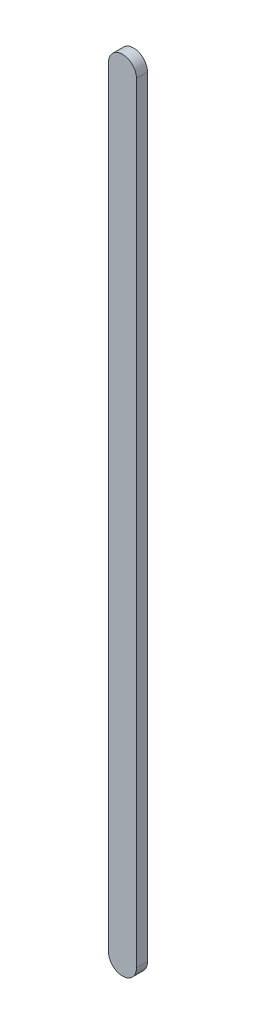
ISO-10303-21;
HEADER;
FILE_DESCRIPTION(('STEP AP214'),'2;1');
FILE_NAME('part.step','',(''),(''),'','','');
FILE_SCHEMA(('AUTOMOTIVE_DESIGN { 1 0 10303 214 1 1 1 1 }'));
ENDSEC;
DATA;
#1=APPLICATION_CONTEXT('core data for automotive mechanical design processes');
#2=APPLICATION_PROTOCOL_DEFINITION('international standard','automotive_design',2000,#1);
#3=PRODUCT_CONTEXT('',#1,'mechanical');
#4=PRODUCT('Part','Part','',(#3));
#5=PRODUCT_RELATED_PRODUCT_CATEGORY('part','',(#4));
#6=PRODUCT_DEFINITION_FORMATION('','',#4);
#7=PRODUCT_DEFINITION_CONTEXT('part definition',#1,'design');
#8=PRODUCT_DEFINITION('design','',#6,#7);
#9=PRODUCT_DEFINITION_SHAPE('','',#8);
#10=(LENGTH_UNIT() NAMED_UNIT(*) SI_UNIT(.MILLI.,.METRE.));
#11=(NAMED_UNIT(*) PLANE_ANGLE_UNIT() SI_UNIT($,.RADIAN.));
#12=(NAMED_UNIT(*) SI_UNIT($,.STERADIAN.) SOLID_ANGLE_UNIT());
#13=UNCERTAINTY_MEASURE_WITH_UNIT(LENGTH_MEASURE(1.E-05),#10,'distance_accuracy_value','');
#14=(GEOMETRIC_REPRESENTATION_CONTEXT(3) GLOBAL_UNCERTAINTY_ASSIGNED_CONTEXT((#13)) GLOBAL_UNIT_ASSIGNED_CONTEXT((#10,
#11,#12)) REPRESENTATION_CONTEXT('',''));
#15=CARTESIAN_POINT('',(0.,0.,0.));
#16=DIRECTION('',(0.,0.,1.));
#17=DIRECTION('',(1.,0.,0.));
#18=AXIS2_PLACEMENT_3D('',#15,#16,#17);
#19=CARTESIAN_POINT('',(96.266,67.183,0.));
#20=DIRECTION('',(-1.,0.,0.));
#21=DIRECTION('',(0.,1.,0.));
#22=AXIS2_PLACEMENT_3D('',#19,#20,#21);
#23=PLANE('',#22);
#24=DIRECTION('',(0.,1.,0.));
#25=VECTOR('',#24,1.);
#26=CARTESIAN_POINT('',(96.266,67.183,0.1999996));
#27=LINE('',#26,#25);
#28=CARTESIAN_POINT('',(96.266,67.183,0.1999996));
#29=VERTEX_POINT('',#28);
#30=CARTESIAN_POINT('',(96.266,81.1500028,0.1999996));
#31=VERTEX_POINT('',#30);
#32=EDGE_CURVE('E11',#29,#31,#27,.T.);
#33=ORIENTED_EDGE('',*,*,#32,.F.);
#34=DIRECTION('',(0.,0.,1.));
#35=VECTOR('',#34,1.);
#36=CARTESIAN_POINT('',(96.266,67.183,0.));
#37=LINE('',#36,#35);
#38=CARTESIAN_POINT('',(96.266,67.183,0.));
#39=VERTEX_POINT('',#38);
#40=EDGE_CURVE('E24',#39,#29,#37,.T.);
#41=ORIENTED_EDGE('',*,*,#40,.F.);
#42=DIRECTION('',(0.,1.,0.));
#43=VECTOR('',#42,1.);
#44=CARTESIAN_POINT('',(96.266,67.183,0.));
#45=LINE('',#44,#43);
#46=CARTESIAN_POINT('',(96.266,81.1500028,0.));
#47=VERTEX_POINT('',#46);
#48=EDGE_CURVE('E75',#39,#47,#45,.T.);
#49=ORIENTED_EDGE('',*,*,#48,.T.);
#50=DIRECTION('',(0.,0.,1.));
#51=VECTOR('',#50,1.);
#52=CARTESIAN_POINT('',(96.266,81.1500028,0.));
#53=LINE('',#52,#51);
#54=EDGE_CURVE('E37',#47,#31,#53,.T.);
#55=ORIENTED_EDGE('',*,*,#54,.T.);
#56=EDGE_LOOP('',(#33,#41,#49,#55));
#57=FACE_BOUND('',#56,.T.);
#58=ADVANCED_FACE('F17',(#57),#23,.F.);
#59=CARTESIAN_POINT('',(96.012,81.1500028,0.));
#60=DIRECTION('',(0.,0.,-1.));
#61=DIRECTION('',(1.,1.11896493820486E-13,0.));
#62=AXIS2_PLACEMENT_3D('',#59,#60,#61);
#63=CYLINDRICAL_SURFACE('',#62,0.25400000000001);
#64=CARTESIAN_POINT('',(96.012,81.1500028,0.1999996));
#65=DIRECTION('',(0.,0.,1.));
#66=DIRECTION('',(1.,1.11896493820486E-13,0.));
#67=AXIS2_PLACEMENT_3D('',#64,#65,#66);
#68=CIRCLE('',#67,0.25400000000001);
#69=CARTESIAN_POINT('',(95.758,81.1500028,0.1999996));
#70=VERTEX_POINT('',#69);
#71=EDGE_CURVE('E83',#31,#70,#68,.T.);
#72=ORIENTED_EDGE('',*,*,#71,.F.);
#73=ORIENTED_EDGE('',*,*,#54,.F.);
#74=CARTESIAN_POINT('',(96.012,81.1500028,0.));
#75=DIRECTION('',(0.,0.,1.));
#76=DIRECTION('',(1.,1.11896493820486E-13,0.));
#77=AXIS2_PLACEMENT_3D('',#74,#75,#76);
#78=CIRCLE('',#77,0.25400000000001);
#79=CARTESIAN_POINT('',(95.758,81.1500028,0.));
#80=VERTEX_POINT('',#79);
#81=EDGE_CURVE('E81',#47,#80,#78,.T.);
#82=ORIENTED_EDGE('',*,*,#81,.T.);
#83=DIRECTION('',(0.,0.,1.));
#84=VECTOR('',#83,1.);
#85=CARTESIAN_POINT('',(95.758,81.1500028,0.));
#86=LINE('',#85,#84);
#87=EDGE_CURVE('E67',#80,#70,#86,.T.);
#88=ORIENTED_EDGE('',*,*,#87,.T.);
#89=EDGE_LOOP('',(#72,#73,#82,#88));
#90=FACE_BOUND('',#89,.T.);
#91=ADVANCED_FACE('F89',(#90),#63,.T.);
#92=CARTESIAN_POINT('',(95.758,81.1500028,0.));
#93=DIRECTION('',(1.,0.,0.));
#94=DIRECTION('',(0.,-1.,0.));
#95=AXIS2_PLACEMENT_3D('',#92,#93,#94);
#96=PLANE('',#95);
#97=DIRECTION('',(0.,-1.,0.));
#98=VECTOR('',#97,1.);
#99=CARTESIAN_POINT('',(95.758,81.1500028,0.1999996));
#100=LINE('',#99,#98);
#101=CARTESIAN_POINT('',(95.758,67.183,0.1999996));
#102=VERTEX_POINT('',#101);
#103=EDGE_CURVE('E71',#70,#102,#100,.T.);
#104=ORIENTED_EDGE('',*,*,#103,.F.);
#105=ORIENTED_EDGE('',*,*,#87,.F.);
#106=DIRECTION('',(0.,-1.,0.));
#107=VECTOR('',#106,1.);
#108=CARTESIAN_POINT('',(95.758,81.1500028,0.));
#109=LINE('',#108,#107);
#110=CARTESIAN_POINT('',(95.758,67.183,0.));
#111=VERTEX_POINT('',#110);
#112=EDGE_CURVE('E63',#80,#111,#109,.T.);
#113=ORIENTED_EDGE('',*,*,#112,.T.);
#114=DIRECTION('',(0.,0.,1.));
#115=VECTOR('',#114,1.);
#116=CARTESIAN_POINT('',(95.758,67.183,0.));
#117=LINE('',#116,#115);
#118=EDGE_CURVE('E53',#111,#102,#117,.T.);
#119=ORIENTED_EDGE('',*,*,#118,.T.);
#120=EDGE_LOOP('',(#104,#105,#113,#119));
#121=FACE_BOUND('',#120,.T.);
#122=ADVANCED_FACE('F66',(#121),#96,.F.);
#123=CARTESIAN_POINT('',(96.012,67.183,0.));
#124=DIRECTION('',(0.,0.,-1.));
#125=DIRECTION('',(-1.,0.,0.));
#126=AXIS2_PLACEMENT_3D('',#123,#124,#125);
#127=CYLINDRICAL_SURFACE('',#126,0.25400000000001);
#128=CARTESIAN_POINT('',(96.012,67.183,0.1999996));
#129=DIRECTION('',(0.,0.,1.));
#130=DIRECTION('',(-1.,0.,0.));
#131=AXIS2_PLACEMENT_3D('',#128,#129,#130);
#132=CIRCLE('',#131,0.25400000000001);
#133=EDGE_CURVE('E59',#102,#29,#132,.T.);
#134=ORIENTED_EDGE('',*,*,#133,.F.);
#135=ORIENTED_EDGE('',*,*,#118,.F.);
#136=CARTESIAN_POINT('',(96.012,67.183,0.));
#137=DIRECTION('',(0.,0.,1.));
#138=DIRECTION('',(-1.,0.,0.));
#139=AXIS2_PLACEMENT_3D('',#136,#137,#138);
#140=CIRCLE('',#139,0.25400000000001);
#141=EDGE_CURVE('E57',#111,#39,#140,.T.);
#142=ORIENTED_EDGE('',*,*,#141,.T.);
#143=ORIENTED_EDGE('',*,*,#40,.T.);
#144=EDGE_LOOP('',(#134,#135,#142,#143));
#145=FACE_BOUND('',#144,.T.);
#146=ADVANCED_FACE('F55',(#145),#127,.T.);
#147=CARTESIAN_POINT('',(96.266,67.183,0.));
#148=DIRECTION('',(0.,0.,-1.));
#149=DIRECTION('',(-1.,0.,0.));
#150=AXIS2_PLACEMENT_3D('',#147,#148,#149);
#151=PLANE('',#150);
#152=ORIENTED_EDGE('',*,*,#141,.F.);
#153=ORIENTED_EDGE('',*,*,#112,.F.);
#154=ORIENTED_EDGE('',*,*,#81,.F.);
#155=ORIENTED_EDGE('',*,*,#48,.F.);
#156=EDGE_LOOP('',(#152,#153,#154,#155));
#157=FACE_BOUND('',#156,.T.);
#158=ADVANCED_FACE('F74',(#157),#151,.T.);
#159=CARTESIAN_POINT('',(96.266,67.183,0.1999996));
#160=DIRECTION('',(0.,0.,-1.));
#161=DIRECTION('',(-1.,0.,0.));
#162=AXIS2_PLACEMENT_3D('',#159,#160,#161);
#163=PLANE('',#162);
#164=ORIENTED_EDGE('',*,*,#32,.T.);
#165=ORIENTED_EDGE('',*,*,#71,.T.);
#166=ORIENTED_EDGE('',*,*,#103,.T.);
#167=ORIENTED_EDGE('',*,*,#133,.T.);
#168=EDGE_LOOP('',(#164,#165,#166,#167));
#169=FACE_BOUND('',#168,.T.);
#170=ADVANCED_FACE('F91',(#169),#163,.F.);
#171=CLOSED_SHELL('',(#58,#91,#122,#146,#158,#170));
#172=MANIFOLD_SOLID_BREP('B1',#171);
#173=ADVANCED_BREP_SHAPE_REPRESENTATION('',(#18,#172),#14);
#174=SHAPE_DEFINITION_REPRESENTATION(#9,#173);
ENDSEC;
END-ISO-10303-21;
